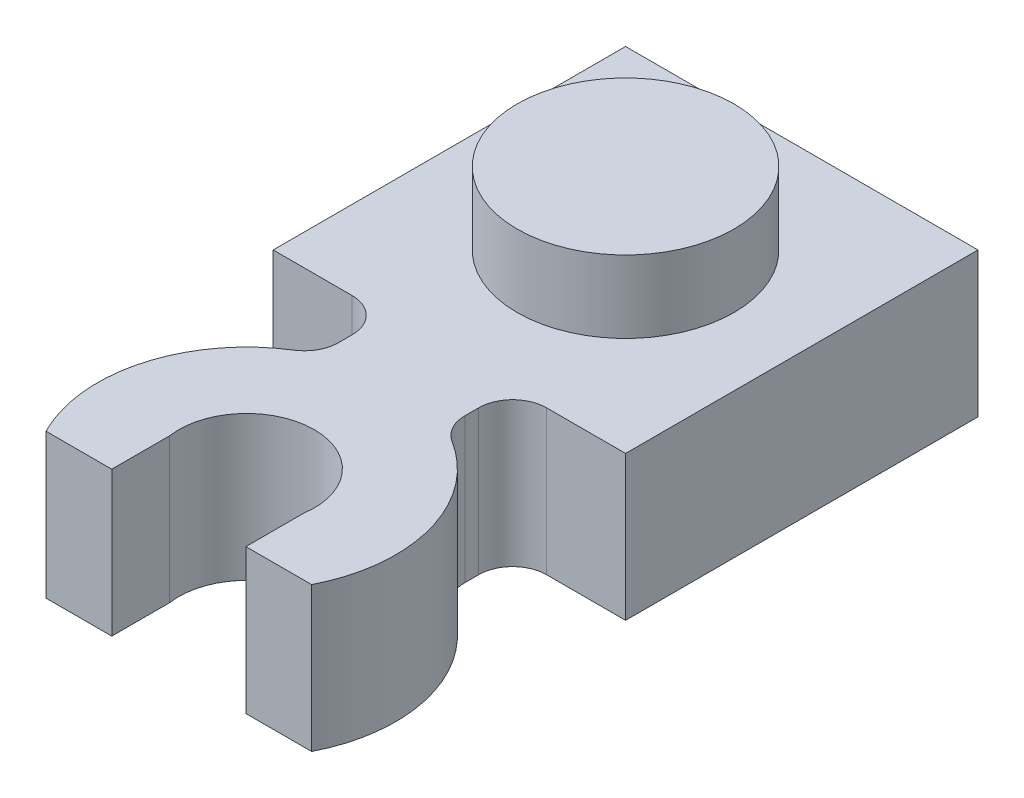
ISO-10303-21;
HEADER;
FILE_DESCRIPTION(('STEP AP214'),'2;1');
FILE_NAME('part.step','',(''),(''),'','','');
FILE_SCHEMA(('AUTOMOTIVE_DESIGN { 1 0 10303 214 1 1 1 1 }'));
ENDSEC;
DATA;
#1=APPLICATION_CONTEXT('core data for automotive mechanical design processes');
#2=APPLICATION_PROTOCOL_DEFINITION('international standard','automotive_design',2000,#1);
#3=PRODUCT_CONTEXT('',#1,'mechanical');
#4=PRODUCT('Part','Part','',(#3));
#5=PRODUCT_RELATED_PRODUCT_CATEGORY('part','',(#4));
#6=PRODUCT_DEFINITION_FORMATION('','',#4);
#7=PRODUCT_DEFINITION_CONTEXT('part definition',#1,'design');
#8=PRODUCT_DEFINITION('design','',#6,#7);
#9=PRODUCT_DEFINITION_SHAPE('','',#8);
#10=(LENGTH_UNIT() NAMED_UNIT(*) SI_UNIT(.MILLI.,.METRE.));
#11=(NAMED_UNIT(*) PLANE_ANGLE_UNIT() SI_UNIT($,.RADIAN.));
#12=(NAMED_UNIT(*) SI_UNIT($,.STERADIAN.) SOLID_ANGLE_UNIT());
#13=UNCERTAINTY_MEASURE_WITH_UNIT(LENGTH_MEASURE(1.E-05),#10,'distance_accuracy_value','');
#14=(GEOMETRIC_REPRESENTATION_CONTEXT(3) GLOBAL_UNCERTAINTY_ASSIGNED_CONTEXT((#13)) GLOBAL_UNIT_ASSIGNED_CONTEXT((#10,
#11,#12)) REPRESENTATION_CONTEXT('',''));
#15=CARTESIAN_POINT('',(0.,0.,0.));
#16=DIRECTION('',(0.,0.,1.));
#17=DIRECTION('',(1.,0.,0.));
#18=AXIS2_PLACEMENT_3D('',#15,#16,#17);
#19=CARTESIAN_POINT('',(0.,0.,0.));
#20=DIRECTION('',(0.,0.,-1.));
#21=DIRECTION('',(-1.,0.,0.));
#22=AXIS2_PLACEMENT_3D('',#19,#20,#21);
#23=PLANE('',#22);
#24=DIRECTION('',(1.,0.,0.));
#25=VECTOR('',#24,1.);
#26=CARTESIAN_POINT('',(0.,0.,0.));
#27=LINE('',#26,#25);
#28=CARTESIAN_POINT('',(0.,0.,0.));
#29=VERTEX_POINT('',#28);
#30=CARTESIAN_POINT('',(1.75,0.,0.));
#31=VERTEX_POINT('',#30);
#32=EDGE_CURVE('E356',#29,#31,#27,.T.);
#33=ORIENTED_EDGE('',*,*,#32,.T.);
#34=DIRECTION('',(0.,-1.,0.));
#35=VECTOR('',#34,1.);
#36=CARTESIAN_POINT('',(1.75,3.2,0.));
#37=LINE('',#36,#35);
#38=CARTESIAN_POINT('',(1.75,3.2,0.));
#39=VERTEX_POINT('',#38);
#40=EDGE_CURVE('E385',#31,#39,#37,.F.);
#41=ORIENTED_EDGE('',*,*,#40,.T.);
#42=DIRECTION('',(-1.,0.,0.));
#43=VECTOR('',#42,1.);
#44=CARTESIAN_POINT('',(0.,3.2,0.));
#45=LINE('',#44,#43);
#46=CARTESIAN_POINT('',(0.,3.2,0.));
#47=VERTEX_POINT('',#46);
#48=EDGE_CURVE('E364',#39,#47,#45,.T.);
#49=ORIENTED_EDGE('',*,*,#48,.T.);
#50=DIRECTION('',(0.,-1.,0.));
#51=VECTOR('',#50,1.);
#52=CARTESIAN_POINT('',(0.,0.,0.));
#53=LINE('',#52,#51);
#54=EDGE_CURVE('E327',#47,#29,#53,.T.);
#55=ORIENTED_EDGE('',*,*,#54,.T.);
#56=EDGE_LOOP('',(#33,#41,#49,#55));
#57=FACE_BOUND('',#56,.T.);
#58=ADVANCED_FACE('F39',(#57),#23,.F.);
#59=CARTESIAN_POINT('',(7.8,3.2,0.));
#60=VERTEX_POINT('',#59);
#61=CARTESIAN_POINT('',(6.05,3.2,0.));
#62=VERTEX_POINT('',#61);
#63=EDGE_CURVE('E339',#60,#62,#45,.T.);
#64=ORIENTED_EDGE('',*,*,#63,.T.);
#65=DIRECTION('',(0.,1.,0.));
#66=VECTOR('',#65,1.);
#67=CARTESIAN_POINT('',(6.05,0.,0.));
#68=LINE('',#67,#66);
#69=CARTESIAN_POINT('',(6.05,0.,0.));
#70=VERTEX_POINT('',#69);
#71=EDGE_CURVE('E61',#62,#70,#68,.F.);
#72=ORIENTED_EDGE('',*,*,#71,.T.);
#73=CARTESIAN_POINT('',(7.8,0.,0.));
#74=VERTEX_POINT('',#73);
#75=EDGE_CURVE('E355',#70,#74,#27,.T.);
#76=ORIENTED_EDGE('',*,*,#75,.T.);
#77=DIRECTION('',(0.,1.,0.));
#78=VECTOR('',#77,1.);
#79=CARTESIAN_POINT('',(7.8,0.,0.));
#80=LINE('',#79,#78);
#81=EDGE_CURVE('E360',#74,#60,#80,.T.);
#82=ORIENTED_EDGE('',*,*,#81,.T.);
#83=EDGE_LOOP('',(#64,#72,#76,#82));
#84=FACE_BOUND('',#83,.T.);
#85=ADVANCED_FACE('F502',(#84),#23,.F.);
#86=CARTESIAN_POINT('',(0.,0.,-7.8));
#87=DIRECTION('',(0.,-1.,0.));
#88=DIRECTION('',(0.,0.,-1.));
#89=AXIS2_PLACEMENT_3D('',#86,#87,#88);
#90=PLANE('',#89);
#91=CARTESIAN_POINT('',(3.7900748001551,0.,0.342701653533859));
#92=DIRECTION('',(0.,-1.,0.));
#93=DIRECTION('',(0.,0.,-1.));
#94=AXIS2_PLACEMENT_3D('',#91,#92,#93);
#95=CIRCLE('',#94,0.42493142203437);
#96=CARTESIAN_POINT('',(3.7900748001551,0.,-0.0822297685005111));
#97=VERTEX_POINT('',#96);
#98=EDGE_CURVE('E449',#97,#97,#95,.T.);
#99=ORIENTED_EDGE('',*,*,#98,.F.);
#100=EDGE_LOOP('',(#99));
#101=FACE_BOUND('',#100,.T.);
#102=DIRECTION('',(0.,0.,-1.));
#103=VECTOR('',#102,1.);
#104=CARTESIAN_POINT('',(5.3,0.,1.5));
#105=LINE('',#104,#103);
#106=CARTESIAN_POINT('',(5.3,0.,1.05611009915068));
#107=VERTEX_POINT('',#106);
#108=CARTESIAN_POINT('',(5.3,0.,0.75));
#109=VERTEX_POINT('',#108);
#110=EDGE_CURVE('E263',#107,#109,#105,.T.);
#111=ORIENTED_EDGE('',*,*,#110,.F.);
#112=CARTESIAN_POINT('',(6.05,0.,1.05611009915068));
#113=DIRECTION('',(0.,-1.,0.));
#114=DIRECTION('',(0.,0.,-1.));
#115=AXIS2_PLACEMENT_3D('',#112,#113,#114);
#116=CIRCLE('',#115,0.75);
#117=CARTESIAN_POINT('',(5.65185185185185,0.,1.69170277699255));
#118=VERTEX_POINT('',#117);
#119=EDGE_CURVE('E420',#107,#118,#116,.F.);
#120=ORIENTED_EDGE('',*,*,#119,.T.);
#121=CARTESIAN_POINT('',(3.9,0.,4.48831055949679));
#122=DIRECTION('',(0.,-1.,0.));
#123=DIRECTION('',(0.,0.,-1.));
#124=AXIS2_PLACEMENT_3D('',#121,#122,#123);
#125=CIRCLE('',#124,3.3);
#126=CARTESIAN_POINT('',(6.83938769133981,0.,5.98831055949679));
#127=VERTEX_POINT('',#126);
#128=EDGE_CURVE('E228',#127,#118,#125,.F.);
#129=ORIENTED_EDGE('',*,*,#128,.F.);
#130=DIRECTION('',(1.,0.,0.));
#131=VECTOR('',#130,1.);
#132=CARTESIAN_POINT('',(6.83938769133981,0.,5.98831055949679));
#133=LINE('',#132,#131);
#134=CARTESIAN_POINT('',(5.38393402062896,0.,5.98831055949679));
#135=VERTEX_POINT('',#134);
#136=EDGE_CURVE('E233',#135,#127,#133,.T.);
#137=ORIENTED_EDGE('',*,*,#136,.F.);
#138=DIRECTION('',(0.,0.,1.));
#139=VECTOR('',#138,1.);
#140=CARTESIAN_POINT('',(5.38393402062896,0.,5.98831055949679));
#141=LINE('',#140,#139);
#142=CARTESIAN_POINT('',(5.38393402062896,0.,4.70726220351888));
#143=VERTEX_POINT('',#142);
#144=EDGE_CURVE('E239',#143,#135,#141,.T.);
#145=ORIENTED_EDGE('',*,*,#144,.F.);
#146=CARTESIAN_POINT('',(3.9,0.,4.48831055949679));
#147=DIRECTION('',(0.,-1.,0.));
#148=DIRECTION('',(0.,0.,-1.));
#149=AXIS2_PLACEMENT_3D('',#146,#147,#148);
#150=CIRCLE('',#149,1.5);
#151=CARTESIAN_POINT('',(2.41606597937104,0.,4.70726220351887));
#152=VERTEX_POINT('',#151);
#153=EDGE_CURVE('E198',#152,#143,#150,.T.);
#154=ORIENTED_EDGE('',*,*,#153,.F.);
#155=DIRECTION('',(0.,0.,-1.));
#156=VECTOR('',#155,1.);
#157=CARTESIAN_POINT('',(2.41606597937104,0.,5.98831055949679));
#158=LINE('',#157,#156);
#159=CARTESIAN_POINT('',(2.41606597937104,0.,5.98831055949679));
#160=VERTEX_POINT('',#159);
#161=EDGE_CURVE('E188',#160,#152,#158,.T.);
#162=ORIENTED_EDGE('',*,*,#161,.F.);
#163=DIRECTION('',(1.,0.,0.));
#164=VECTOR('',#163,1.);
#165=CARTESIAN_POINT('',(0.960612308660186,0.,5.98831055949679));
#166=LINE('',#165,#164);
#167=CARTESIAN_POINT('',(0.960612308660186,0.,5.98831055949679));
#168=VERTEX_POINT('',#167);
#169=EDGE_CURVE('E195',#168,#160,#166,.T.);
#170=ORIENTED_EDGE('',*,*,#169,.F.);
#171=CARTESIAN_POINT('',(2.14814814814815,0.,1.69170277699255));
#172=VERTEX_POINT('',#171);
#173=EDGE_CURVE('E232',#172,#168,#125,.F.);
#174=ORIENTED_EDGE('',*,*,#173,.F.);
#175=CARTESIAN_POINT('',(1.75,0.,1.05611009915068));
#176=DIRECTION('',(0.,-1.,0.));
#177=DIRECTION('',(0.,0.,-1.));
#178=AXIS2_PLACEMENT_3D('',#175,#176,#177);
#179=CIRCLE('',#178,0.75);
#180=CARTESIAN_POINT('',(2.5,0.,1.05611009915068));
#181=VERTEX_POINT('',#180);
#182=EDGE_CURVE('E398',#172,#181,#179,.F.);
#183=ORIENTED_EDGE('',*,*,#182,.T.);
#184=DIRECTION('',(0.,0.,-1.));
#185=VECTOR('',#184,1.);
#186=CARTESIAN_POINT('',(2.5,0.,1.5));
#187=LINE('',#186,#185);
#188=CARTESIAN_POINT('',(2.5,0.,0.75));
#189=VERTEX_POINT('',#188);
#190=EDGE_CURVE('E267',#181,#189,#187,.T.);
#191=ORIENTED_EDGE('',*,*,#190,.T.);
#192=CARTESIAN_POINT('',(1.75,0.,0.75));
#193=DIRECTION('',(0.,-1.,0.));
#194=DIRECTION('',(0.,0.,-1.));
#195=AXIS2_PLACEMENT_3D('',#192,#193,#194);
#196=CIRCLE('',#195,0.75);
#197=EDGE_CURVE('E392',#189,#31,#196,.F.);
#198=ORIENTED_EDGE('',*,*,#197,.T.);
#199=ORIENTED_EDGE('',*,*,#32,.F.);
#200=DIRECTION('',(0.,0.,1.));
#201=VECTOR('',#200,1.);
#202=CARTESIAN_POINT('',(0.,0.,-7.8));
#203=LINE('',#202,#201);
#204=CARTESIAN_POINT('',(0.,0.,-7.8));
#205=VERTEX_POINT('',#204);
#206=EDGE_CURVE('E351',#205,#29,#203,.T.);
#207=ORIENTED_EDGE('',*,*,#206,.F.);
#208=DIRECTION('',(1.,0.,0.));
#209=VECTOR('',#208,1.);
#210=CARTESIAN_POINT('',(0.,0.,-7.8));
#211=LINE('',#210,#209);
#212=CARTESIAN_POINT('',(7.8,0.,-7.8));
#213=VERTEX_POINT('',#212);
#214=EDGE_CURVE('E338',#205,#213,#211,.T.);
#215=ORIENTED_EDGE('',*,*,#214,.T.);
#216=DIRECTION('',(0.,0.,1.));
#217=VECTOR('',#216,1.);
#218=CARTESIAN_POINT('',(7.8,0.,-7.8));
#219=LINE('',#218,#217);
#220=EDGE_CURVE('E373',#213,#74,#219,.T.);
#221=ORIENTED_EDGE('',*,*,#220,.T.);
#222=ORIENTED_EDGE('',*,*,#75,.F.);
#223=CARTESIAN_POINT('',(6.05,0.,0.75));
#224=DIRECTION('',(0.,-1.,0.));
#225=DIRECTION('',(0.,0.,-1.));
#226=AXIS2_PLACEMENT_3D('',#223,#224,#225);
#227=CIRCLE('',#226,0.75);
#228=EDGE_CURVE('E11',#70,#109,#227,.F.);
#229=ORIENTED_EDGE('',*,*,#228,.T.);
#230=EDGE_LOOP('',(#111,#120,#129,#137,#145,#154,#162,#170,#174,#183,#191,#198,#199,#207,#215,
#221,#222,#229));
#231=FACE_BOUND('',#230,.T.);
#232=DIRECTION('',(0.,0.,1.));
#233=VECTOR('',#232,1.);
#234=CARTESIAN_POINT('',(0.7,0.,-7.8));
#235=LINE('',#234,#233);
#236=CARTESIAN_POINT('',(0.7,0.,-7.1));
#237=VERTEX_POINT('',#236);
#238=CARTESIAN_POINT('',(0.7,0.,-0.7));
#239=VERTEX_POINT('',#238);
#240=EDGE_CURVE('E303',#237,#239,#235,.T.);
#241=ORIENTED_EDGE('',*,*,#240,.T.);
#242=DIRECTION('',(1.,0.,0.));
#243=VECTOR('',#242,1.);
#244=CARTESIAN_POINT('',(0.,0.,-0.7));
#245=LINE('',#244,#243);
#246=CARTESIAN_POINT('',(7.1,0.,-0.7));
#247=VERTEX_POINT('',#246);
#248=EDGE_CURVE('E276',#239,#247,#245,.T.);
#249=ORIENTED_EDGE('',*,*,#248,.T.);
#250=DIRECTION('',(0.,0.,1.));
#251=VECTOR('',#250,1.);
#252=CARTESIAN_POINT('',(7.1,0.,-7.8));
#253=LINE('',#252,#251);
#254=CARTESIAN_POINT('',(7.1,0.,-7.1));
#255=VERTEX_POINT('',#254);
#256=EDGE_CURVE('E298',#255,#247,#253,.T.);
#257=ORIENTED_EDGE('',*,*,#256,.F.);
#258=DIRECTION('',(1.,0.,0.));
#259=VECTOR('',#258,1.);
#260=CARTESIAN_POINT('',(0.,0.,-7.1));
#261=LINE('',#260,#259);
#262=EDGE_CURVE('E286',#237,#255,#261,.T.);
#263=ORIENTED_EDGE('',*,*,#262,.F.);
#264=EDGE_LOOP('',(#241,#249,#257,#263));
#265=FACE_BOUND('',#264,.T.);
#266=ADVANCED_FACE('F191',(#101,#231,#265),#90,.T.);
#267=CARTESIAN_POINT('',(0.,0.,-7.8));
#268=DIRECTION('',(-1.,0.,0.));
#269=DIRECTION('',(0.,0.,1.));
#270=AXIS2_PLACEMENT_3D('',#267,#268,#269);
#271=PLANE('',#270);
#272=ORIENTED_EDGE('',*,*,#54,.F.);
#273=DIRECTION('',(0.,0.,1.));
#274=VECTOR('',#273,1.);
#275=CARTESIAN_POINT('',(0.,3.2,-7.8));
#276=LINE('',#275,#274);
#277=CARTESIAN_POINT('',(0.,3.2,-7.8));
#278=VERTEX_POINT('',#277);
#279=EDGE_CURVE('E333',#278,#47,#276,.T.);
#280=ORIENTED_EDGE('',*,*,#279,.F.);
#281=DIRECTION('',(0.,-1.,0.));
#282=VECTOR('',#281,1.);
#283=CARTESIAN_POINT('',(0.,0.,-7.8));
#284=LINE('',#283,#282);
#285=EDGE_CURVE('E334',#278,#205,#284,.T.);
#286=ORIENTED_EDGE('',*,*,#285,.T.);
#287=ORIENTED_EDGE('',*,*,#206,.T.);
#288=EDGE_LOOP('',(#272,#280,#286,#287));
#289=FACE_BOUND('',#288,.T.);
#290=ADVANCED_FACE('F515',(#289),#271,.T.);
#291=CARTESIAN_POINT('',(0.,3.2,-7.8));
#292=DIRECTION('',(0.,1.,0.));
#293=DIRECTION('',(0.,0.,1.));
#294=AXIS2_PLACEMENT_3D('',#291,#292,#293);
#295=PLANE('',#294);
#296=DIRECTION('',(0.,0.,-1.));
#297=VECTOR('',#296,1.);
#298=CARTESIAN_POINT('',(2.5,3.2,1.5));
#299=LINE('',#298,#297);
#300=CARTESIAN_POINT('',(2.5,3.2,1.05611009915068));
#301=VERTEX_POINT('',#300);
#302=CARTESIAN_POINT('',(2.5,3.2,0.75));
#303=VERTEX_POINT('',#302);
#304=EDGE_CURVE('E256',#301,#303,#299,.T.);
#305=ORIENTED_EDGE('',*,*,#304,.F.);
#306=CARTESIAN_POINT('',(1.75,3.2,1.05611009915068));
#307=DIRECTION('',(0.,1.,0.));
#308=DIRECTION('',(0.,0.,1.));
#309=AXIS2_PLACEMENT_3D('',#306,#307,#308);
#310=CIRCLE('',#309,0.75);
#311=CARTESIAN_POINT('',(2.14814814814815,3.2,1.69170277699255));
#312=VERTEX_POINT('',#311);
#313=EDGE_CURVE('E401',#301,#312,#310,.F.);
#314=ORIENTED_EDGE('',*,*,#313,.T.);
#315=CARTESIAN_POINT('',(3.9,3.2,4.48831055949679));
#316=DIRECTION('',(0.,1.,0.));
#317=DIRECTION('',(0.,0.,1.));
#318=AXIS2_PLACEMENT_3D('',#315,#316,#317);
#319=CIRCLE('',#318,3.3);
#320=CARTESIAN_POINT('',(0.960612308660186,3.2,5.98831055949679));
#321=VERTEX_POINT('',#320);
#322=EDGE_CURVE('E441',#312,#321,#319,.T.);
#323=ORIENTED_EDGE('',*,*,#322,.T.);
#324=DIRECTION('',(1.,0.,0.));
#325=VECTOR('',#324,1.);
#326=CARTESIAN_POINT('',(0.960612308660186,3.2,5.98831055949679));
#327=LINE('',#326,#325);
#328=CARTESIAN_POINT('',(2.41606597937104,3.2,5.98831055949679));
#329=VERTEX_POINT('',#328);
#330=EDGE_CURVE('E447',#321,#329,#327,.T.);
#331=ORIENTED_EDGE('',*,*,#330,.T.);
#332=DIRECTION('',(0.,0.,-1.));
#333=VECTOR('',#332,1.);
#334=CARTESIAN_POINT('',(2.41606597937104,3.2,5.98831055949679));
#335=LINE('',#334,#333);
#336=CARTESIAN_POINT('',(2.41606597937104,3.2,4.70726220351887));
#337=VERTEX_POINT('',#336);
#338=EDGE_CURVE('E208',#329,#337,#335,.T.);
#339=ORIENTED_EDGE('',*,*,#338,.T.);
#340=CARTESIAN_POINT('',(3.9,3.2,4.48831055949679));
#341=DIRECTION('',(0.,-1.,0.));
#342=DIRECTION('',(0.,0.,1.));
#343=AXIS2_PLACEMENT_3D('',#340,#341,#342);
#344=CIRCLE('',#343,1.5);
#345=CARTESIAN_POINT('',(5.38393402062896,3.2,4.70726220351888));
#346=VERTEX_POINT('',#345);
#347=EDGE_CURVE('E460',#337,#346,#344,.T.);
#348=ORIENTED_EDGE('',*,*,#347,.T.);
#349=DIRECTION('',(0.,0.,1.));
#350=VECTOR('',#349,1.);
#351=CARTESIAN_POINT('',(5.38393402062896,3.2,5.98831055949679));
#352=LINE('',#351,#350);
#353=CARTESIAN_POINT('',(5.38393402062896,3.2,5.98831055949679));
#354=VERTEX_POINT('',#353);
#355=EDGE_CURVE('E222',#346,#354,#352,.T.);
#356=ORIENTED_EDGE('',*,*,#355,.T.);
#357=DIRECTION('',(1.,0.,0.));
#358=VECTOR('',#357,1.);
#359=CARTESIAN_POINT('',(6.83938769133981,3.2,5.98831055949679));
#360=LINE('',#359,#358);
#361=CARTESIAN_POINT('',(6.83938769133981,3.2,5.98831055949679));
#362=VERTEX_POINT('',#361);
#363=EDGE_CURVE('E218',#354,#362,#360,.T.);
#364=ORIENTED_EDGE('',*,*,#363,.T.);
#365=CARTESIAN_POINT('',(5.65185185185185,3.2,1.69170277699255));
#366=VERTEX_POINT('',#365);
#367=EDGE_CURVE('E226',#362,#366,#319,.T.);
#368=ORIENTED_EDGE('',*,*,#367,.T.);
#369=CARTESIAN_POINT('',(6.05,3.2,1.05611009915068));
#370=DIRECTION('',(0.,1.,0.));
#371=DIRECTION('',(0.,0.,1.));
#372=AXIS2_PLACEMENT_3D('',#369,#370,#371);
#373=CIRCLE('',#372,0.75);
#374=CARTESIAN_POINT('',(5.3,3.2,1.05611009915068));
#375=VERTEX_POINT('',#374);
#376=EDGE_CURVE('E417',#366,#375,#373,.F.);
#377=ORIENTED_EDGE('',*,*,#376,.T.);
#378=DIRECTION('',(0.,0.,-1.));
#379=VECTOR('',#378,1.);
#380=CARTESIAN_POINT('',(5.3,3.2,1.5));
#381=LINE('',#380,#379);
#382=CARTESIAN_POINT('',(5.3,3.2,0.75));
#383=VERTEX_POINT('',#382);
#384=EDGE_CURVE('E260',#375,#383,#381,.T.);
#385=ORIENTED_EDGE('',*,*,#384,.T.);
#386=CARTESIAN_POINT('',(6.05,3.2,0.75));
#387=DIRECTION('',(0.,1.,0.));
#388=DIRECTION('',(0.,0.,1.));
#389=AXIS2_PLACEMENT_3D('',#386,#387,#388);
#390=CIRCLE('',#389,0.75);
#391=EDGE_CURVE('E48',#383,#62,#390,.F.);
#392=ORIENTED_EDGE('',*,*,#391,.T.);
#393=ORIENTED_EDGE('',*,*,#63,.F.);
#394=DIRECTION('',(0.,0.,1.));
#395=VECTOR('',#394,1.);
#396=CARTESIAN_POINT('',(7.8,3.2,-7.8));
#397=LINE('',#396,#395);
#398=CARTESIAN_POINT('',(7.8,3.2,-7.8));
#399=VERTEX_POINT('',#398);
#400=EDGE_CURVE('E370',#399,#60,#397,.T.);
#401=ORIENTED_EDGE('',*,*,#400,.F.);
#402=DIRECTION('',(-1.,0.,0.));
#403=VECTOR('',#402,1.);
#404=CARTESIAN_POINT('',(0.,3.2,-7.8));
#405=LINE('',#404,#403);
#406=EDGE_CURVE('E347',#399,#278,#405,.T.);
#407=ORIENTED_EDGE('',*,*,#406,.T.);
#408=ORIENTED_EDGE('',*,*,#279,.T.);
#409=ORIENTED_EDGE('',*,*,#48,.F.);
#410=CARTESIAN_POINT('',(1.75,3.2,0.75));
#411=DIRECTION('',(0.,1.,0.));
#412=DIRECTION('',(0.,0.,1.));
#413=AXIS2_PLACEMENT_3D('',#410,#411,#412);
#414=CIRCLE('',#413,0.75);
#415=EDGE_CURVE('E395',#39,#303,#414,.F.);
#416=ORIENTED_EDGE('',*,*,#415,.T.);
#417=EDGE_LOOP('',(#305,#314,#323,#331,#339,#348,#356,#364,#368,#377,#385,#392,#393,#401,#407,
#408,#409,#416));
#418=FACE_BOUND('',#417,.T.);
#419=CARTESIAN_POINT('',(3.9,3.2,-3.9));
#420=DIRECTION('',(0.,1.,0.));
#421=DIRECTION('',(0.,0.,1.));
#422=AXIS2_PLACEMENT_3D('',#419,#420,#421);
#423=CIRCLE('',#422,2.4);
#424=CARTESIAN_POINT('',(3.9,3.2,-1.5));
#425=VERTEX_POINT('',#424);
#426=EDGE_CURVE('E328',#425,#425,#423,.T.);
#427=ORIENTED_EDGE('',*,*,#426,.F.);
#428=EDGE_LOOP('',(#427));
#429=FACE_BOUND('',#428,.T.);
#430=ADVANCED_FACE('F439',(#418,#429),#295,.T.);
#431=CARTESIAN_POINT('',(7.8,0.,-7.8));
#432=DIRECTION('',(1.,0.,0.));
#433=DIRECTION('',(0.,0.,-1.));
#434=AXIS2_PLACEMENT_3D('',#431,#432,#433);
#435=PLANE('',#434);
#436=ORIENTED_EDGE('',*,*,#81,.F.);
#437=ORIENTED_EDGE('',*,*,#220,.F.);
#438=DIRECTION('',(0.,1.,0.));
#439=VECTOR('',#438,1.);
#440=CARTESIAN_POINT('',(7.8,0.,-7.8));
#441=LINE('',#440,#439);
#442=EDGE_CURVE('E343',#213,#399,#441,.T.);
#443=ORIENTED_EDGE('',*,*,#442,.T.);
#444=ORIENTED_EDGE('',*,*,#400,.T.);
#445=EDGE_LOOP('',(#436,#437,#443,#444));
#446=FACE_BOUND('',#445,.T.);
#447=ADVANCED_FACE('F514',(#446),#435,.T.);
#448=CARTESIAN_POINT('',(0.,0.,-7.8));
#449=DIRECTION('',(0.,0.,-1.));
#450=DIRECTION('',(-1.,0.,0.));
#451=AXIS2_PLACEMENT_3D('',#448,#449,#450);
#452=PLANE('',#451);
#453=ORIENTED_EDGE('',*,*,#285,.F.);
#454=ORIENTED_EDGE('',*,*,#406,.F.);
#455=ORIENTED_EDGE('',*,*,#442,.F.);
#456=ORIENTED_EDGE('',*,*,#214,.F.);
#457=EDGE_LOOP('',(#453,#454,#455,#456));
#458=FACE_BOUND('',#457,.T.);
#459=ADVANCED_FACE('F510',(#458),#452,.T.);
#460=CARTESIAN_POINT('',(3.9,4.8,-3.9));
#461=DIRECTION('',(0.,-1.,0.));
#462=DIRECTION('',(0.,0.,-1.));
#463=AXIS2_PLACEMENT_3D('',#460,#461,#462);
#464=CYLINDRICAL_SURFACE('',#463,2.4);
#465=CARTESIAN_POINT('',(3.9,4.8,-3.9));
#466=DIRECTION('',(0.,1.,0.));
#467=DIRECTION('',(0.,0.,1.));
#468=AXIS2_PLACEMENT_3D('',#465,#466,#467);
#469=CIRCLE('',#468,2.4);
#470=CARTESIAN_POINT('',(3.9,4.8,-1.5));
#471=VERTEX_POINT('',#470);
#472=EDGE_CURVE('E291',#471,#471,#469,.T.);
#473=ORIENTED_EDGE('',*,*,#472,.F.);
#474=EDGE_LOOP('',(#473));
#475=FACE_BOUND('',#474,.T.);
#476=ORIENTED_EDGE('',*,*,#426,.T.);
#477=EDGE_LOOP('',(#476));
#478=FACE_BOUND('',#477,.T.);
#479=ADVANCED_FACE('F622',(#475,#478),#464,.T.);
#480=CARTESIAN_POINT('',(3.9,4.8,-3.9));
#481=DIRECTION('',(0.,1.,0.));
#482=DIRECTION('',(0.,0.,1.));
#483=AXIS2_PLACEMENT_3D('',#480,#481,#482);
#484=PLANE('',#483);
#485=ORIENTED_EDGE('',*,*,#472,.T.);
#486=EDGE_LOOP('',(#485));
#487=FACE_BOUND('',#486,.T.);
#488=ADVANCED_FACE('F597',(#487),#484,.T.);
#489=CARTESIAN_POINT('',(0.7,0.,-7.8));
#490=DIRECTION('',(-1.,0.,0.));
#491=DIRECTION('',(0.,0.,1.));
#492=AXIS2_PLACEMENT_3D('',#489,#490,#491);
#493=PLANE('',#492);
#494=DIRECTION('',(0.,-1.,0.));
#495=VECTOR('',#494,1.);
#496=CARTESIAN_POINT('',(0.7,0.,-0.7));
#497=LINE('',#496,#495);
#498=CARTESIAN_POINT('',(0.7,2.5,-0.7));
#499=VERTEX_POINT('',#498);
#500=EDGE_CURVE('E272',#499,#239,#497,.T.);
#501=ORIENTED_EDGE('',*,*,#500,.T.);
#502=ORIENTED_EDGE('',*,*,#240,.F.);
#503=DIRECTION('',(0.,-1.,0.));
#504=VECTOR('',#503,1.);
#505=CARTESIAN_POINT('',(0.7,0.,-7.1));
#506=LINE('',#505,#504);
#507=CARTESIAN_POINT('',(0.7,2.5,-7.1));
#508=VERTEX_POINT('',#507);
#509=EDGE_CURVE('E282',#508,#237,#506,.T.);
#510=ORIENTED_EDGE('',*,*,#509,.F.);
#511=DIRECTION('',(0.,0.,1.));
#512=VECTOR('',#511,1.);
#513=CARTESIAN_POINT('',(0.7,2.5,-7.8));
#514=LINE('',#513,#512);
#515=EDGE_CURVE('E277',#508,#499,#514,.T.);
#516=ORIENTED_EDGE('',*,*,#515,.T.);
#517=EDGE_LOOP('',(#501,#502,#510,#516));
#518=FACE_BOUND('',#517,.T.);
#519=ADVANCED_FACE('F593',(#518),#493,.F.);
#520=CARTESIAN_POINT('',(0.,2.5,-7.8));
#521=DIRECTION('',(0.,1.,0.));
#522=DIRECTION('',(0.,0.,1.));
#523=AXIS2_PLACEMENT_3D('',#520,#521,#522);
#524=PLANE('',#523);
#525=CARTESIAN_POINT('',(3.9,2.5,-3.9));
#526=DIRECTION('',(0.,1.,0.));
#527=DIRECTION('',(0.,0.,1.));
#528=AXIS2_PLACEMENT_3D('',#525,#526,#527);
#529=CIRCLE('',#528,1.7);
#530=CARTESIAN_POINT('',(3.9,2.5,-2.2));
#531=VERTEX_POINT('',#530);
#532=EDGE_CURVE('E280',#531,#531,#529,.T.);
#533=ORIENTED_EDGE('',*,*,#532,.T.);
#534=EDGE_LOOP('',(#533));
#535=FACE_BOUND('',#534,.T.);
#536=DIRECTION('',(-1.,0.,0.));
#537=VECTOR('',#536,1.);
#538=CARTESIAN_POINT('',(0.,2.5,-0.7));
#539=LINE('',#538,#537);
#540=CARTESIAN_POINT('',(7.1,2.5,-0.7));
#541=VERTEX_POINT('',#540);
#542=EDGE_CURVE('E287',#541,#499,#539,.T.);
#543=ORIENTED_EDGE('',*,*,#542,.T.);
#544=ORIENTED_EDGE('',*,*,#515,.F.);
#545=DIRECTION('',(-1.,0.,0.));
#546=VECTOR('',#545,1.);
#547=CARTESIAN_POINT('',(0.,2.5,-7.1));
#548=LINE('',#547,#546);
#549=CARTESIAN_POINT('',(7.1,2.5,-7.1));
#550=VERTEX_POINT('',#549);
#551=EDGE_CURVE('E299',#550,#508,#548,.T.);
#552=ORIENTED_EDGE('',*,*,#551,.F.);
#553=DIRECTION('',(0.,0.,1.));
#554=VECTOR('',#553,1.);
#555=CARTESIAN_POINT('',(7.1,2.5,-7.8));
#556=LINE('',#555,#554);
#557=EDGE_CURVE('E281',#550,#541,#556,.T.);
#558=ORIENTED_EDGE('',*,*,#557,.T.);
#559=EDGE_LOOP('',(#543,#544,#552,#558));
#560=FACE_BOUND('',#559,.T.);
#561=ADVANCED_FACE('F596',(#535,#560),#524,.F.);
#562=CARTESIAN_POINT('',(7.1,0.,-7.8));
#563=DIRECTION('',(1.,0.,0.));
#564=DIRECTION('',(0.,0.,-1.));
#565=AXIS2_PLACEMENT_3D('',#562,#563,#564);
#566=PLANE('',#565);
#567=DIRECTION('',(0.,1.,0.));
#568=VECTOR('',#567,1.);
#569=CARTESIAN_POINT('',(7.1,0.,-0.7));
#570=LINE('',#569,#568);
#571=EDGE_CURVE('E295',#247,#541,#570,.T.);
#572=ORIENTED_EDGE('',*,*,#571,.T.);
#573=ORIENTED_EDGE('',*,*,#557,.F.);
#574=DIRECTION('',(0.,1.,0.));
#575=VECTOR('',#574,1.);
#576=CARTESIAN_POINT('',(7.1,0.,-7.1));
#577=LINE('',#576,#575);
#578=EDGE_CURVE('E304',#255,#550,#577,.T.);
#579=ORIENTED_EDGE('',*,*,#578,.F.);
#580=ORIENTED_EDGE('',*,*,#256,.T.);
#581=EDGE_LOOP('',(#572,#573,#579,#580));
#582=FACE_BOUND('',#581,.T.);
#583=ADVANCED_FACE('F601',(#582),#566,.F.);
#584=CARTESIAN_POINT('',(0.,0.,-7.1));
#585=DIRECTION('',(0.,0.,-1.));
#586=DIRECTION('',(-1.,0.,0.));
#587=AXIS2_PLACEMENT_3D('',#584,#585,#586);
#588=PLANE('',#587);
#589=ORIENTED_EDGE('',*,*,#509,.T.);
#590=ORIENTED_EDGE('',*,*,#262,.T.);
#591=ORIENTED_EDGE('',*,*,#578,.T.);
#592=ORIENTED_EDGE('',*,*,#551,.T.);
#593=EDGE_LOOP('',(#589,#590,#591,#592));
#594=FACE_BOUND('',#593,.T.);
#595=ADVANCED_FACE('F605',(#594),#588,.F.);
#596=CARTESIAN_POINT('',(0.,0.,-0.7));
#597=DIRECTION('',(0.,0.,-1.));
#598=DIRECTION('',(-1.,0.,0.));
#599=AXIS2_PLACEMENT_3D('',#596,#597,#598);
#600=PLANE('',#599);
#601=ORIENTED_EDGE('',*,*,#500,.F.);
#602=ORIENTED_EDGE('',*,*,#542,.F.);
#603=ORIENTED_EDGE('',*,*,#571,.F.);
#604=ORIENTED_EDGE('',*,*,#248,.F.);
#605=EDGE_LOOP('',(#601,#602,#603,#604));
#606=FACE_BOUND('',#605,.T.);
#607=ADVANCED_FACE('F609',(#606),#600,.T.);
#608=CARTESIAN_POINT('',(3.9,4.8,-3.9));
#609=DIRECTION('',(0.,-1.,0.));
#610=DIRECTION('',(0.,0.,-1.));
#611=AXIS2_PLACEMENT_3D('',#608,#609,#610);
#612=CYLINDRICAL_SURFACE('',#611,1.7);
#613=CARTESIAN_POINT('',(3.9,4.1,-3.9));
#614=DIRECTION('',(0.,1.,0.));
#615=DIRECTION('',(0.,0.,1.));
#616=AXIS2_PLACEMENT_3D('',#613,#614,#615);
#617=CIRCLE('',#616,1.7);
#618=CARTESIAN_POINT('',(3.9,4.1,-2.2));
#619=VERTEX_POINT('',#618);
#620=EDGE_CURVE('E271',#619,#619,#617,.T.);
#621=ORIENTED_EDGE('',*,*,#620,.T.);
#622=EDGE_LOOP('',(#621));
#623=FACE_BOUND('',#622,.T.);
#624=ORIENTED_EDGE('',*,*,#532,.F.);
#625=EDGE_LOOP('',(#624));
#626=FACE_BOUND('',#625,.T.);
#627=ADVANCED_FACE('F613',(#623,#626),#612,.F.);
#628=CARTESIAN_POINT('',(3.9,4.1,-3.9));
#629=DIRECTION('',(0.,1.,0.));
#630=DIRECTION('',(0.,0.,1.));
#631=AXIS2_PLACEMENT_3D('',#628,#629,#630);
#632=PLANE('',#631);
#633=ORIENTED_EDGE('',*,*,#620,.F.);
#634=EDGE_LOOP('',(#633));
#635=FACE_BOUND('',#634,.T.);
#636=ADVANCED_FACE('F592',(#635),#632,.F.);
#637=CARTESIAN_POINT('',(2.5,0.,1.5));
#638=DIRECTION('',(1.,0.,0.));
#639=DIRECTION('',(0.,0.,-1.));
#640=AXIS2_PLACEMENT_3D('',#637,#638,#639);
#641=PLANE('',#640);
#642=ORIENTED_EDGE('',*,*,#304,.T.);
#643=DIRECTION('',(0.,-1.,0.));
#644=VECTOR('',#643,1.);
#645=CARTESIAN_POINT('',(2.5,0.,0.75));
#646=LINE('',#645,#644);
#647=EDGE_CURVE('E381',#303,#189,#646,.T.);
#648=ORIENTED_EDGE('',*,*,#647,.T.);
#649=ORIENTED_EDGE('',*,*,#190,.F.);
#650=DIRECTION('',(0.,1.,0.));
#651=VECTOR('',#650,1.);
#652=CARTESIAN_POINT('',(2.5,0.,1.05611009915068));
#653=LINE('',#652,#651);
#654=EDGE_CURVE('E332',#181,#301,#653,.T.);
#655=ORIENTED_EDGE('',*,*,#654,.T.);
#656=EDGE_LOOP('',(#642,#648,#649,#655));
#657=FACE_BOUND('',#656,.T.);
#658=ADVANCED_FACE('F434',(#657),#641,.F.);
#659=CARTESIAN_POINT('',(5.3,3.2,1.5));
#660=DIRECTION('',(-1.,0.,0.));
#661=DIRECTION('',(0.,0.,1.));
#662=AXIS2_PLACEMENT_3D('',#659,#660,#661);
#663=PLANE('',#662);
#664=ORIENTED_EDGE('',*,*,#384,.F.);
#665=DIRECTION('',(0.,1.,0.));
#666=VECTOR('',#665,1.);
#667=CARTESIAN_POINT('',(5.3,3.2,1.05611009915068));
#668=LINE('',#667,#666);
#669=EDGE_CURVE('E412',#375,#107,#668,.F.);
#670=ORIENTED_EDGE('',*,*,#669,.T.);
#671=ORIENTED_EDGE('',*,*,#110,.T.);
#672=DIRECTION('',(0.,1.,0.));
#673=VECTOR('',#672,1.);
#674=CARTESIAN_POINT('',(5.3,3.2,0.75));
#675=LINE('',#674,#673);
#676=EDGE_CURVE('E408',#109,#383,#675,.T.);
#677=ORIENTED_EDGE('',*,*,#676,.T.);
#678=EDGE_LOOP('',(#664,#670,#671,#677));
#679=FACE_BOUND('',#678,.T.);
#680=ADVANCED_FACE('F488',(#679),#663,.F.);
#681=CARTESIAN_POINT('',(3.9,-8.16088230524127,4.48831055949679));
#682=DIRECTION('',(0.,1.,0.));
#683=DIRECTION('',(0.,0.,1.));
#684=AXIS2_PLACEMENT_3D('',#681,#682,#683);
#685=CYLINDRICAL_SURFACE('',#684,3.3);
#686=ORIENTED_EDGE('',*,*,#322,.F.);
#687=DIRECTION('',(0.,1.,0.));
#688=VECTOR('',#687,1.);
#689=CARTESIAN_POINT('',(2.14814814814815,-8.16088230524127,1.69170277699255));
#690=LINE('',#689,#688);
#691=EDGE_CURVE('E388',#312,#172,#690,.F.);
#692=ORIENTED_EDGE('',*,*,#691,.T.);
#693=ORIENTED_EDGE('',*,*,#173,.T.);
#694=DIRECTION('',(0.,1.,0.));
#695=VECTOR('',#694,1.);
#696=CARTESIAN_POINT('',(0.960612308660186,-8.16088230524127,5.98831055949679));
#697=LINE('',#696,#695);
#698=EDGE_CURVE('E216',#168,#321,#697,.T.);
#699=ORIENTED_EDGE('',*,*,#698,.T.);
#700=EDGE_LOOP('',(#686,#692,#693,#699));
#701=FACE_BOUND('',#700,.T.);
#702=ADVANCED_FACE('F428',(#701),#685,.T.);
#703=ORIENTED_EDGE('',*,*,#128,.T.);
#704=DIRECTION('',(0.,1.,0.));
#705=VECTOR('',#704,1.);
#706=CARTESIAN_POINT('',(5.65185185185185,-8.16088230524127,1.69170277699255));
#707=LINE('',#706,#705);
#708=EDGE_CURVE('E404',#118,#366,#707,.T.);
#709=ORIENTED_EDGE('',*,*,#708,.T.);
#710=ORIENTED_EDGE('',*,*,#367,.F.);
#711=DIRECTION('',(0.,1.,0.));
#712=VECTOR('',#711,1.);
#713=CARTESIAN_POINT('',(6.83938769133981,-8.16088230524127,5.98831055949679));
#714=LINE('',#713,#712);
#715=EDGE_CURVE('E237',#127,#362,#714,.T.);
#716=ORIENTED_EDGE('',*,*,#715,.F.);
#717=EDGE_LOOP('',(#703,#709,#710,#716));
#718=FACE_BOUND('',#717,.T.);
#719=ADVANCED_FACE('F481',(#718),#685,.T.);
#720=CARTESIAN_POINT('',(0.960612308660186,-8.16088230524127,5.98831055949679));
#721=DIRECTION('',(0.,0.,1.));
#722=DIRECTION('',(1.,0.,0.));
#723=AXIS2_PLACEMENT_3D('',#720,#721,#722);
#724=PLANE('',#723);
#725=ORIENTED_EDGE('',*,*,#698,.F.);
#726=ORIENTED_EDGE('',*,*,#169,.T.);
#727=DIRECTION('',(0.,1.,0.));
#728=VECTOR('',#727,1.);
#729=CARTESIAN_POINT('',(2.41606597937104,-8.16088230524127,5.98831055949679));
#730=LINE('',#729,#728);
#731=EDGE_CURVE('E203',#160,#329,#730,.T.);
#732=ORIENTED_EDGE('',*,*,#731,.T.);
#733=ORIENTED_EDGE('',*,*,#330,.F.);
#734=EDGE_LOOP('',(#725,#726,#732,#733));
#735=FACE_BOUND('',#734,.T.);
#736=ADVANCED_FACE('F214',(#735),#724,.T.);
#737=CARTESIAN_POINT('',(2.41606597937104,-8.16088230524127,5.98831055949679));
#738=DIRECTION('',(1.,0.,0.));
#739=DIRECTION('',(0.,0.,-1.));
#740=AXIS2_PLACEMENT_3D('',#737,#738,#739);
#741=PLANE('',#740);
#742=ORIENTED_EDGE('',*,*,#731,.F.);
#743=ORIENTED_EDGE('',*,*,#161,.T.);
#744=DIRECTION('',(0.,1.,0.));
#745=VECTOR('',#744,1.);
#746=CARTESIAN_POINT('',(2.41606597937104,-8.16088230524127,4.70726220351887));
#747=LINE('',#746,#745);
#748=EDGE_CURVE('E202',#152,#337,#747,.T.);
#749=ORIENTED_EDGE('',*,*,#748,.T.);
#750=ORIENTED_EDGE('',*,*,#338,.F.);
#751=EDGE_LOOP('',(#742,#743,#749,#750));
#752=FACE_BOUND('',#751,.T.);
#753=ADVANCED_FACE('F206',(#752),#741,.T.);
#754=CARTESIAN_POINT('',(3.9,-8.16088230524127,4.48831055949679));
#755=DIRECTION('',(0.,1.,0.));
#756=DIRECTION('',(0.,0.,1.));
#757=AXIS2_PLACEMENT_3D('',#754,#755,#756);
#758=CYLINDRICAL_SURFACE('',#757,1.5);
#759=ORIENTED_EDGE('',*,*,#748,.F.);
#760=ORIENTED_EDGE('',*,*,#153,.T.);
#761=DIRECTION('',(0.,1.,0.));
#762=VECTOR('',#761,1.);
#763=CARTESIAN_POINT('',(5.38393402062896,-8.16088230524127,4.70726220351888));
#764=LINE('',#763,#762);
#765=EDGE_CURVE('E243',#143,#346,#764,.T.);
#766=ORIENTED_EDGE('',*,*,#765,.T.);
#767=ORIENTED_EDGE('',*,*,#347,.F.);
#768=EDGE_LOOP('',(#759,#760,#766,#767));
#769=FACE_BOUND('',#768,.T.);
#770=ADVANCED_FACE('F470',(#769),#758,.F.);
#771=CARTESIAN_POINT('',(5.38393402062896,-8.16088230524127,5.98831055949679));
#772=DIRECTION('',(-1.,0.,0.));
#773=DIRECTION('',(0.,0.,1.));
#774=AXIS2_PLACEMENT_3D('',#771,#772,#773);
#775=PLANE('',#774);
#776=ORIENTED_EDGE('',*,*,#765,.F.);
#777=ORIENTED_EDGE('',*,*,#144,.T.);
#778=DIRECTION('',(0.,1.,0.));
#779=VECTOR('',#778,1.);
#780=CARTESIAN_POINT('',(5.38393402062896,-8.16088230524127,5.98831055949679));
#781=LINE('',#780,#779);
#782=EDGE_CURVE('E238',#135,#354,#781,.T.);
#783=ORIENTED_EDGE('',*,*,#782,.T.);
#784=ORIENTED_EDGE('',*,*,#355,.F.);
#785=EDGE_LOOP('',(#776,#777,#783,#784));
#786=FACE_BOUND('',#785,.T.);
#787=ADVANCED_FACE('F473',(#786),#775,.T.);
#788=CARTESIAN_POINT('',(6.83938769133981,-8.16088230524127,5.98831055949679));
#789=DIRECTION('',(0.,0.,1.));
#790=DIRECTION('',(1.,0.,0.));
#791=AXIS2_PLACEMENT_3D('',#788,#789,#790);
#792=PLANE('',#791);
#793=ORIENTED_EDGE('',*,*,#782,.F.);
#794=ORIENTED_EDGE('',*,*,#136,.T.);
#795=ORIENTED_EDGE('',*,*,#715,.T.);
#796=ORIENTED_EDGE('',*,*,#363,.F.);
#797=EDGE_LOOP('',(#793,#794,#795,#796));
#798=FACE_BOUND('',#797,.T.);
#799=ADVANCED_FACE('F476',(#798),#792,.T.);
#800=CARTESIAN_POINT('',(1.75,0.,0.75));
#801=DIRECTION('',(0.,1.,0.));
#802=DIRECTION('',(0.,0.,1.));
#803=AXIS2_PLACEMENT_3D('',#800,#801,#802);
#804=CYLINDRICAL_SURFACE('',#803,0.75);
#805=ORIENTED_EDGE('',*,*,#415,.F.);
#806=ORIENTED_EDGE('',*,*,#40,.F.);
#807=ORIENTED_EDGE('',*,*,#197,.F.);
#808=ORIENTED_EDGE('',*,*,#647,.F.);
#809=EDGE_LOOP('',(#805,#806,#807,#808));
#810=FACE_BOUND('',#809,.T.);
#811=ADVANCED_FACE('F525',(#810),#804,.F.);
#812=CARTESIAN_POINT('',(1.75,-8.16088230524127,1.05611009915068));
#813=DIRECTION('',(0.,1.,0.));
#814=DIRECTION('',(0.,0.,1.));
#815=AXIS2_PLACEMENT_3D('',#812,#813,#814);
#816=CYLINDRICAL_SURFACE('',#815,0.75);
#817=ORIENTED_EDGE('',*,*,#313,.F.);
#818=ORIENTED_EDGE('',*,*,#654,.F.);
#819=ORIENTED_EDGE('',*,*,#182,.F.);
#820=ORIENTED_EDGE('',*,*,#691,.F.);
#821=EDGE_LOOP('',(#817,#818,#819,#820));
#822=FACE_BOUND('',#821,.T.);
#823=ADVANCED_FACE('F438',(#822),#816,.F.);
#824=CARTESIAN_POINT('',(6.05,-8.16088230524127,1.05611009915068));
#825=DIRECTION('',(0.,1.,0.));
#826=DIRECTION('',(0.,0.,1.));
#827=AXIS2_PLACEMENT_3D('',#824,#825,#826);
#828=CYLINDRICAL_SURFACE('',#827,0.75);
#829=ORIENTED_EDGE('',*,*,#119,.F.);
#830=ORIENTED_EDGE('',*,*,#669,.F.);
#831=ORIENTED_EDGE('',*,*,#376,.F.);
#832=ORIENTED_EDGE('',*,*,#708,.F.);
#833=EDGE_LOOP('',(#829,#830,#831,#832));
#834=FACE_BOUND('',#833,.T.);
#835=ADVANCED_FACE('F485',(#834),#828,.F.);
#836=CARTESIAN_POINT('',(6.05,3.2,0.75));
#837=DIRECTION('',(0.,-1.,0.));
#838=DIRECTION('',(0.,0.,-1.));
#839=AXIS2_PLACEMENT_3D('',#836,#837,#838);
#840=CYLINDRICAL_SURFACE('',#839,0.75);
#841=ORIENTED_EDGE('',*,*,#228,.F.);
#842=ORIENTED_EDGE('',*,*,#71,.F.);
#843=ORIENTED_EDGE('',*,*,#391,.F.);
#844=ORIENTED_EDGE('',*,*,#676,.F.);
#845=EDGE_LOOP('',(#841,#842,#843,#844));
#846=FACE_BOUND('',#845,.T.);
#847=ADVANCED_FACE('F41',(#846),#840,.F.);
#848=CARTESIAN_POINT('',(3.7900748001551,1.6,0.342701653533859));
#849=DIRECTION('',(0.,-1.,0.));
#850=DIRECTION('',(0.,0.,-1.));
#851=AXIS2_PLACEMENT_3D('',#848,#849,#850);
#852=CYLINDRICAL_SURFACE('',#851,0.42493142203437);
#853=CARTESIAN_POINT('',(3.7900748001551,1.6,0.342701653533859));
#854=DIRECTION('',(0.,-1.,0.));
#855=DIRECTION('',(0.,0.,-1.));
#856=AXIS2_PLACEMENT_3D('',#853,#854,#855);
#857=CIRCLE('',#856,0.42493142203437);
#858=CARTESIAN_POINT('',(3.7900748001551,1.6,-0.0822297685005111));
#859=VERTEX_POINT('',#858);
#860=EDGE_CURVE('E443',#859,#859,#857,.T.);
#861=ORIENTED_EDGE('',*,*,#860,.F.);
#862=EDGE_LOOP('',(#861));
#863=FACE_BOUND('',#862,.T.);
#864=ORIENTED_EDGE('',*,*,#98,.T.);
#865=EDGE_LOOP('',(#864));
#866=FACE_BOUND('',#865,.T.);
#867=ADVANCED_FACE('F493',(#863,#866),#852,.F.);
#868=CARTESIAN_POINT('',(3.7900748001551,1.6,0.342701653533859));
#869=DIRECTION('',(0.,-1.,0.));
#870=DIRECTION('',(0.,0.,-1.));
#871=AXIS2_PLACEMENT_3D('',#868,#869,#870);
#872=PLANE('',#871);
#873=ORIENTED_EDGE('',*,*,#860,.T.);
#874=EDGE_LOOP('',(#873));
#875=FACE_BOUND('',#874,.T.);
#876=ADVANCED_FACE('F498',(#875),#872,.T.);
#877=CLOSED_SHELL('',(#58,#85,#266,#290,#430,#447,#459,#479,#488,#519,#561,#583,#595,#607,#627,
#636,#658,#680,#702,#719,#736,#753,#770,#787,#799,#811,#823,#835,#847,#867,#876));
#878=MANIFOLD_SOLID_BREP('B2',#877);
#879=ADVANCED_BREP_SHAPE_REPRESENTATION('',(#18,#878),#14);
#880=SHAPE_DEFINITION_REPRESENTATION(#9,#879);
ENDSEC;
END-ISO-10303-21;
